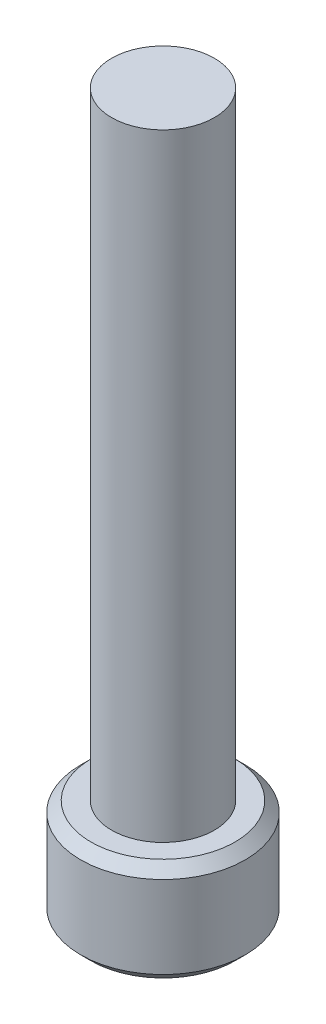
ISO-10303-21;
HEADER;
FILE_DESCRIPTION(('STEP AP214'),'2;1');
FILE_NAME('part.step','',(''),(''),'','','');
FILE_SCHEMA(('AUTOMOTIVE_DESIGN { 1 0 10303 214 1 1 1 1 }'));
ENDSEC;
DATA;
#1=APPLICATION_CONTEXT('core data for automotive mechanical design processes');
#2=APPLICATION_PROTOCOL_DEFINITION('international standard','automotive_design',2000,#1);
#3=PRODUCT_CONTEXT('',#1,'mechanical');
#4=PRODUCT('Part','Part','',(#3));
#5=PRODUCT_RELATED_PRODUCT_CATEGORY('part','',(#4));
#6=PRODUCT_DEFINITION_FORMATION('','',#4);
#7=PRODUCT_DEFINITION_CONTEXT('part definition',#1,'design');
#8=PRODUCT_DEFINITION('design','',#6,#7);
#9=PRODUCT_DEFINITION_SHAPE('','',#8);
#10=(LENGTH_UNIT() NAMED_UNIT(*) SI_UNIT(.MILLI.,.METRE.));
#11=(NAMED_UNIT(*) PLANE_ANGLE_UNIT() SI_UNIT($,.RADIAN.));
#12=(NAMED_UNIT(*) SI_UNIT($,.STERADIAN.) SOLID_ANGLE_UNIT());
#13=UNCERTAINTY_MEASURE_WITH_UNIT(LENGTH_MEASURE(1.E-05),#10,'distance_accuracy_value','');
#14=(GEOMETRIC_REPRESENTATION_CONTEXT(3) GLOBAL_UNCERTAINTY_ASSIGNED_CONTEXT((#13)) GLOBAL_UNIT_ASSIGNED_CONTEXT((#10,
#11,#12)) REPRESENTATION_CONTEXT('',''));
#15=CARTESIAN_POINT('',(0.,0.,0.));
#16=DIRECTION('',(0.,0.,1.));
#17=DIRECTION('',(1.,0.,0.));
#18=AXIS2_PLACEMENT_3D('',#15,#16,#17);
#19=CARTESIAN_POINT('',(0.,30.,0.));
#20=DIRECTION('',(0.,-1.,0.));
#21=DIRECTION('',(0.,0.,-1.));
#22=AXIS2_PLACEMENT_3D('',#19,#20,#21);
#23=CYLINDRICAL_SURFACE('',#22,2.5);
#24=CARTESIAN_POINT('',(0.,30.,0.));
#25=DIRECTION('',(0.,1.,0.));
#26=DIRECTION('',(0.,0.,1.));
#27=AXIS2_PLACEMENT_3D('',#24,#25,#26);
#28=CIRCLE('',#27,2.5);
#29=CARTESIAN_POINT('',(0.,30.,2.5));
#30=VERTEX_POINT('',#29);
#31=EDGE_CURVE('E126',#30,#30,#28,.T.);
#32=ORIENTED_EDGE('',*,*,#31,.F.);
#33=EDGE_LOOP('',(#32));
#34=FACE_BOUND('',#33,.T.);
#35=CARTESIAN_POINT('',(0.,0.,0.));
#36=DIRECTION('',(0.,-1.,0.));
#37=DIRECTION('',(0.,0.,-1.));
#38=AXIS2_PLACEMENT_3D('',#35,#36,#37);
#39=CIRCLE('',#38,2.5);
#40=CARTESIAN_POINT('',(0.,0.,-2.5));
#41=VERTEX_POINT('',#40);
#42=EDGE_CURVE('E116',#41,#41,#39,.T.);
#43=ORIENTED_EDGE('',*,*,#42,.F.);
#44=EDGE_LOOP('',(#43));
#45=FACE_BOUND('',#44,.T.);
#46=ADVANCED_FACE('F32',(#34,#45),#23,.T.);
#47=CARTESIAN_POINT('',(0.,30.,0.));
#48=DIRECTION('',(0.,1.,0.));
#49=DIRECTION('',(0.,0.,1.));
#50=AXIS2_PLACEMENT_3D('',#47,#48,#49);
#51=PLANE('',#50);
#52=ORIENTED_EDGE('',*,*,#31,.T.);
#53=EDGE_LOOP('',(#52));
#54=FACE_BOUND('',#53,.T.);
#55=ADVANCED_FACE('F184',(#54),#51,.T.);
#56=CARTESIAN_POINT('',(0.,0.,0.));
#57=DIRECTION('',(0.,-1.,0.));
#58=DIRECTION('',(0.,0.,-1.));
#59=AXIS2_PLACEMENT_3D('',#56,#57,#58);
#60=PLANE('',#59);
#61=CARTESIAN_POINT('',(0.,0.,0.));
#62=DIRECTION('',(0.,-1.,0.));
#63=DIRECTION('',(0.,0.,-1.));
#64=AXIS2_PLACEMENT_3D('',#61,#62,#63);
#65=CIRCLE('',#64,3.49999999999999);
#66=CARTESIAN_POINT('',(0.,0.,-3.49999999999999));
#67=VERTEX_POINT('',#66);
#68=EDGE_CURVE('E11',#67,#67,#65,.F.);
#69=ORIENTED_EDGE('',*,*,#68,.T.);
#70=EDGE_LOOP('',(#69));
#71=FACE_BOUND('',#70,.T.);
#72=ORIENTED_EDGE('',*,*,#42,.T.);
#73=EDGE_LOOP('',(#72));
#74=FACE_BOUND('',#73,.T.);
#75=ADVANCED_FACE('F190',(#71,#74),#60,.F.);
#76=CARTESIAN_POINT('',(0.,-5.,0.));
#77=DIRECTION('',(0.,-1.,0.));
#78=DIRECTION('',(0.,0.,-1.));
#79=AXIS2_PLACEMENT_3D('',#76,#77,#78);
#80=CYLINDRICAL_SURFACE('',#79,4.);
#81=CARTESIAN_POINT('',(0.,-4.5,0.));
#82=DIRECTION('',(0.,1.,0.));
#83=DIRECTION('',(0.,0.,1.));
#84=AXIS2_PLACEMENT_3D('',#81,#82,#83);
#85=CIRCLE('',#84,4.);
#86=CARTESIAN_POINT('',(0.,-4.5,4.));
#87=VERTEX_POINT('',#86);
#88=EDGE_CURVE('E40',#87,#87,#85,.T.);
#89=ORIENTED_EDGE('',*,*,#88,.T.);
#90=EDGE_LOOP('',(#89));
#91=FACE_BOUND('',#90,.T.);
#92=CARTESIAN_POINT('',(0.,-0.500000000000004,0.));
#93=DIRECTION('',(0.,-1.,0.));
#94=DIRECTION('',(0.,0.,-1.));
#95=AXIS2_PLACEMENT_3D('',#92,#93,#94);
#96=CIRCLE('',#95,4.);
#97=CARTESIAN_POINT('',(0.,-0.500000000000004,-4.));
#98=VERTEX_POINT('',#97);
#99=EDGE_CURVE('E146',#98,#98,#96,.T.);
#100=ORIENTED_EDGE('',*,*,#99,.T.);
#101=EDGE_LOOP('',(#100));
#102=FACE_BOUND('',#101,.T.);
#103=ADVANCED_FACE('F151',(#91,#102),#80,.T.);
#104=CARTESIAN_POINT('',(-4.,-5.,0.));
#105=DIRECTION('',(0.,1.,0.));
#106=DIRECTION('',(0.,0.,1.));
#107=AXIS2_PLACEMENT_3D('',#104,#105,#106);
#108=PLANE('',#107);
#109=CARTESIAN_POINT('',(0.,-5.,0.));
#110=DIRECTION('',(0.,1.,0.));
#111=DIRECTION('',(0.,0.,1.));
#112=AXIS2_PLACEMENT_3D('',#109,#110,#111);
#113=CIRCLE('',#112,3.5);
#114=CARTESIAN_POINT('',(0.,-5.,3.5));
#115=VERTEX_POINT('',#114);
#116=EDGE_CURVE('E143',#115,#115,#113,.F.);
#117=ORIENTED_EDGE('',*,*,#116,.T.);
#118=EDGE_LOOP('',(#117));
#119=FACE_BOUND('',#118,.T.);
#120=DIRECTION('',(1.,0.,0.));
#121=VECTOR('',#120,1.);
#122=CARTESIAN_POINT('',(-4.,-5.,2.5));
#123=LINE('',#122,#121);
#124=CARTESIAN_POINT('',(-1.44337567297406,-5.,2.5));
#125=VERTEX_POINT('',#124);
#126=CARTESIAN_POINT('',(1.44337567297407,-5.,2.5));
#127=VERTEX_POINT('',#126);
#128=EDGE_CURVE('E139',#125,#127,#123,.T.);
#129=ORIENTED_EDGE('',*,*,#128,.T.);
#130=DIRECTION('',(0.5,0.,-0.866025403784439));
#131=VECTOR('',#130,1.);
#132=CARTESIAN_POINT('',(1.1650635094611,-5.,2.98205080756888));
#133=LINE('',#132,#131);
#134=CARTESIAN_POINT('',(2.88675134594813,-5.,0.));
#135=VERTEX_POINT('',#134);
#136=EDGE_CURVE('E55',#127,#135,#133,.T.);
#137=ORIENTED_EDGE('',*,*,#136,.T.);
#138=DIRECTION('',(-0.5,0.,-0.866025403784439));
#139=VECTOR('',#138,1.);
#140=CARTESIAN_POINT('',(1.1650635094611,-5.,-2.98205080756888));
#141=LINE('',#140,#139);
#142=CARTESIAN_POINT('',(1.44337567297406,-5.,-2.5));
#143=VERTEX_POINT('',#142);
#144=EDGE_CURVE('E88',#135,#143,#141,.T.);
#145=ORIENTED_EDGE('',*,*,#144,.T.);
#146=DIRECTION('',(-1.,0.,0.));
#147=VECTOR('',#146,1.);
#148=CARTESIAN_POINT('',(-4.,-5.,-2.5));
#149=LINE('',#148,#147);
#150=CARTESIAN_POINT('',(-1.44337567297406,-5.,-2.5));
#151=VERTEX_POINT('',#150);
#152=EDGE_CURVE('E130',#143,#151,#149,.T.);
#153=ORIENTED_EDGE('',*,*,#152,.T.);
#154=DIRECTION('',(-0.5,0.,0.866025403784439));
#155=VECTOR('',#154,1.);
#156=CARTESIAN_POINT('',(-3.1650635094611,-5.,0.482050807568877));
#157=LINE('',#156,#155);
#158=CARTESIAN_POINT('',(-2.88675134594813,-5.,0.));
#159=VERTEX_POINT('',#158);
#160=EDGE_CURVE('E133',#151,#159,#157,.T.);
#161=ORIENTED_EDGE('',*,*,#160,.T.);
#162=DIRECTION('',(0.5,0.,0.866025403784439));
#163=VECTOR('',#162,1.);
#164=CARTESIAN_POINT('',(-3.1650635094611,-5.,-0.482050807568877));
#165=LINE('',#164,#163);
#166=EDGE_CURVE('E136',#159,#125,#165,.T.);
#167=ORIENTED_EDGE('',*,*,#166,.T.);
#168=EDGE_LOOP('',(#129,#137,#145,#153,#161,#167));
#169=FACE_BOUND('',#168,.T.);
#170=ADVANCED_FACE('F159',(#119,#169),#108,.F.);
#171=CARTESIAN_POINT('',(1.44337567297407,-31.,2.5));
#172=DIRECTION('',(0.866025403784439,0.,0.5));
#173=DIRECTION('',(0.5,0.,-0.866025403784439));
#174=AXIS2_PLACEMENT_3D('',#171,#172,#173);
#175=PLANE('',#174);
#176=DIRECTION('',(0.,1.,0.));
#177=VECTOR('',#176,1.);
#178=CARTESIAN_POINT('',(1.44337567297407,-31.,2.5));
#179=LINE('',#178,#177);
#180=CARTESIAN_POINT('',(1.44337567297407,-1.,2.5));
#181=VERTEX_POINT('',#180);
#182=EDGE_CURVE('E104',#127,#181,#179,.T.);
#183=ORIENTED_EDGE('',*,*,#182,.T.);
#184=DIRECTION('',(0.5,0.,-0.866025403784439));
#185=VECTOR('',#184,1.);
#186=CARTESIAN_POINT('',(1.44337567297407,-1.,2.5));
#187=LINE('',#186,#185);
#188=CARTESIAN_POINT('',(2.88675134594813,-1.,0.));
#189=VERTEX_POINT('',#188);
#190=EDGE_CURVE('E97',#181,#189,#187,.T.);
#191=ORIENTED_EDGE('',*,*,#190,.T.);
#192=DIRECTION('',(0.,1.,0.));
#193=VECTOR('',#192,1.);
#194=CARTESIAN_POINT('',(2.88675134594813,-31.,0.));
#195=LINE('',#194,#193);
#196=EDGE_CURVE('E83',#135,#189,#195,.T.);
#197=ORIENTED_EDGE('',*,*,#196,.F.);
#198=ORIENTED_EDGE('',*,*,#136,.F.);
#199=EDGE_LOOP('',(#183,#191,#197,#198));
#200=FACE_BOUND('',#199,.T.);
#201=ADVANCED_FACE('F103',(#200),#175,.F.);
#202=CARTESIAN_POINT('',(-1.44337567297406,-31.,2.5));
#203=DIRECTION('',(0.,0.,1.));
#204=DIRECTION('',(1.,0.,0.));
#205=AXIS2_PLACEMENT_3D('',#202,#203,#204);
#206=PLANE('',#205);
#207=DIRECTION('',(0.,1.,0.));
#208=VECTOR('',#207,1.);
#209=CARTESIAN_POINT('',(-1.44337567297406,-31.,2.5));
#210=LINE('',#209,#208);
#211=CARTESIAN_POINT('',(-1.44337567297406,-1.,2.5));
#212=VERTEX_POINT('',#211);
#213=EDGE_CURVE('E117',#125,#212,#210,.T.);
#214=ORIENTED_EDGE('',*,*,#213,.T.);
#215=DIRECTION('',(1.,0.,0.));
#216=VECTOR('',#215,1.);
#217=CARTESIAN_POINT('',(-1.44337567297406,-1.,2.5));
#218=LINE('',#217,#216);
#219=EDGE_CURVE('E90',#212,#181,#218,.T.);
#220=ORIENTED_EDGE('',*,*,#219,.T.);
#221=ORIENTED_EDGE('',*,*,#182,.F.);
#222=ORIENTED_EDGE('',*,*,#128,.F.);
#223=EDGE_LOOP('',(#214,#220,#221,#222));
#224=FACE_BOUND('',#223,.T.);
#225=ADVANCED_FACE('F165',(#224),#206,.F.);
#226=CARTESIAN_POINT('',(-2.88675134594813,-31.,0.));
#227=DIRECTION('',(-0.866025403784439,0.,0.5));
#228=DIRECTION('',(0.5,0.,0.866025403784439));
#229=AXIS2_PLACEMENT_3D('',#226,#227,#228);
#230=PLANE('',#229);
#231=DIRECTION('',(0.,1.,0.));
#232=VECTOR('',#231,1.);
#233=CARTESIAN_POINT('',(-2.88675134594813,-31.,0.));
#234=LINE('',#233,#232);
#235=CARTESIAN_POINT('',(-2.88675134594813,-1.,0.));
#236=VERTEX_POINT('',#235);
#237=EDGE_CURVE('E119',#159,#236,#234,.T.);
#238=ORIENTED_EDGE('',*,*,#237,.T.);
#239=DIRECTION('',(0.5,0.,0.866025403784439));
#240=VECTOR('',#239,1.);
#241=CARTESIAN_POINT('',(-2.88675134594813,-1.,0.));
#242=LINE('',#241,#240);
#243=EDGE_CURVE('E111',#236,#212,#242,.T.);
#244=ORIENTED_EDGE('',*,*,#243,.T.);
#245=ORIENTED_EDGE('',*,*,#213,.F.);
#246=ORIENTED_EDGE('',*,*,#166,.F.);
#247=EDGE_LOOP('',(#238,#244,#245,#246));
#248=FACE_BOUND('',#247,.T.);
#249=ADVANCED_FACE('F167',(#248),#230,.F.);
#250=CARTESIAN_POINT('',(-1.44337567297406,-31.,-2.5));
#251=DIRECTION('',(-0.866025403784439,0.,-0.5));
#252=DIRECTION('',(-0.5,0.,0.866025403784439));
#253=AXIS2_PLACEMENT_3D('',#250,#251,#252);
#254=PLANE('',#253);
#255=DIRECTION('',(0.,1.,0.));
#256=VECTOR('',#255,1.);
#257=CARTESIAN_POINT('',(-1.44337567297406,-31.,-2.5));
#258=LINE('',#257,#256);
#259=CARTESIAN_POINT('',(-1.44337567297406,-1.,-2.5));
#260=VERTEX_POINT('',#259);
#261=EDGE_CURVE('E121',#151,#260,#258,.T.);
#262=ORIENTED_EDGE('',*,*,#261,.T.);
#263=DIRECTION('',(-0.5,0.,0.866025403784439));
#264=VECTOR('',#263,1.);
#265=CARTESIAN_POINT('',(-1.44337567297406,-1.,-2.5));
#266=LINE('',#265,#264);
#267=EDGE_CURVE('E108',#260,#236,#266,.T.);
#268=ORIENTED_EDGE('',*,*,#267,.T.);
#269=ORIENTED_EDGE('',*,*,#237,.F.);
#270=ORIENTED_EDGE('',*,*,#160,.F.);
#271=EDGE_LOOP('',(#262,#268,#269,#270));
#272=FACE_BOUND('',#271,.T.);
#273=ADVANCED_FACE('F171',(#272),#254,.F.);
#274=CARTESIAN_POINT('',(1.44337567297406,-31.,-2.5));
#275=DIRECTION('',(0.,0.,-1.));
#276=DIRECTION('',(-1.,0.,0.));
#277=AXIS2_PLACEMENT_3D('',#274,#275,#276);
#278=PLANE('',#277);
#279=DIRECTION('',(0.,1.,0.));
#280=VECTOR('',#279,1.);
#281=CARTESIAN_POINT('',(1.44337567297406,-31.,-2.5));
#282=LINE('',#281,#280);
#283=CARTESIAN_POINT('',(1.44337567297406,-1.,-2.5));
#284=VERTEX_POINT('',#283);
#285=EDGE_CURVE('E47',#143,#284,#282,.T.);
#286=ORIENTED_EDGE('',*,*,#285,.T.);
#287=DIRECTION('',(-1.,0.,0.));
#288=VECTOR('',#287,1.);
#289=CARTESIAN_POINT('',(1.44337567297406,-1.,-2.5));
#290=LINE('',#289,#288);
#291=EDGE_CURVE('E101',#284,#260,#290,.T.);
#292=ORIENTED_EDGE('',*,*,#291,.T.);
#293=ORIENTED_EDGE('',*,*,#261,.F.);
#294=ORIENTED_EDGE('',*,*,#152,.F.);
#295=EDGE_LOOP('',(#286,#292,#293,#294));
#296=FACE_BOUND('',#295,.T.);
#297=ADVANCED_FACE('F174',(#296),#278,.F.);
#298=CARTESIAN_POINT('',(2.88675134594813,-31.,0.));
#299=DIRECTION('',(0.866025403784438,0.,-0.5));
#300=DIRECTION('',(-0.5,0.,-0.866025403784439));
#301=AXIS2_PLACEMENT_3D('',#298,#299,#300);
#302=PLANE('',#301);
#303=ORIENTED_EDGE('',*,*,#196,.T.);
#304=DIRECTION('',(-0.5,0.,-0.866025403784439));
#305=VECTOR('',#304,1.);
#306=CARTESIAN_POINT('',(2.88675134594813,-1.,0.));
#307=LINE('',#306,#305);
#308=EDGE_CURVE('E86',#189,#284,#307,.T.);
#309=ORIENTED_EDGE('',*,*,#308,.T.);
#310=ORIENTED_EDGE('',*,*,#285,.F.);
#311=ORIENTED_EDGE('',*,*,#144,.F.);
#312=EDGE_LOOP('',(#303,#309,#310,#311));
#313=FACE_BOUND('',#312,.T.);
#314=ADVANCED_FACE('F85',(#313),#302,.F.);
#315=CARTESIAN_POINT('',(0.,-1.,0.));
#316=DIRECTION('',(0.,1.,0.));
#317=DIRECTION('',(0.,0.,1.));
#318=AXIS2_PLACEMENT_3D('',#315,#316,#317);
#319=PLANE('',#318);
#320=ORIENTED_EDGE('',*,*,#190,.F.);
#321=ORIENTED_EDGE('',*,*,#219,.F.);
#322=ORIENTED_EDGE('',*,*,#243,.F.);
#323=ORIENTED_EDGE('',*,*,#267,.F.);
#324=ORIENTED_EDGE('',*,*,#291,.F.);
#325=ORIENTED_EDGE('',*,*,#308,.F.);
#326=EDGE_LOOP('',(#320,#321,#322,#323,#324,#325));
#327=FACE_BOUND('',#326,.T.);
#328=ADVANCED_FACE('F95',(#327),#319,.F.);
#329=CARTESIAN_POINT('',(0.,-5.,0.));
#330=DIRECTION('',(0.,1.,0.));
#331=DIRECTION('',(0.,0.,1.));
#332=AXIS2_PLACEMENT_3D('',#329,#330,#331);
#333=CONICAL_SURFACE('',#332,3.5,0.785398163397448);
#334=ORIENTED_EDGE('',*,*,#88,.F.);
#335=EDGE_LOOP('',(#334));
#336=FACE_BOUND('',#335,.T.);
#337=ORIENTED_EDGE('',*,*,#116,.F.);
#338=EDGE_LOOP('',(#337));
#339=FACE_BOUND('',#338,.T.);
#340=ADVANCED_FACE('F154',(#336,#339),#333,.T.);
#341=CARTESIAN_POINT('',(0.,-0.500000000000004,0.));
#342=DIRECTION('',(0.,-1.,0.));
#343=DIRECTION('',(0.,0.,-1.));
#344=AXIS2_PLACEMENT_3D('',#341,#342,#343);
#345=CONICAL_SURFACE('',#344,4.,0.785398163397452);
#346=ORIENTED_EDGE('',*,*,#68,.F.);
#347=EDGE_LOOP('',(#346));
#348=FACE_BOUND('',#347,.T.);
#349=ORIENTED_EDGE('',*,*,#99,.F.);
#350=EDGE_LOOP('',(#349));
#351=FACE_BOUND('',#350,.T.);
#352=ADVANCED_FACE('F34',(#348,#351),#345,.T.);
#353=CLOSED_SHELL('',(#46,#55,#75,#103,#170,#201,#225,#249,#273,#297,#314,#328,#340,#352));
#354=MANIFOLD_SOLID_BREP('B2',#353);
#355=ADVANCED_BREP_SHAPE_REPRESENTATION('',(#18,#354),#14);
#356=SHAPE_DEFINITION_REPRESENTATION(#9,#355);
ENDSEC;
END-ISO-10303-21;
